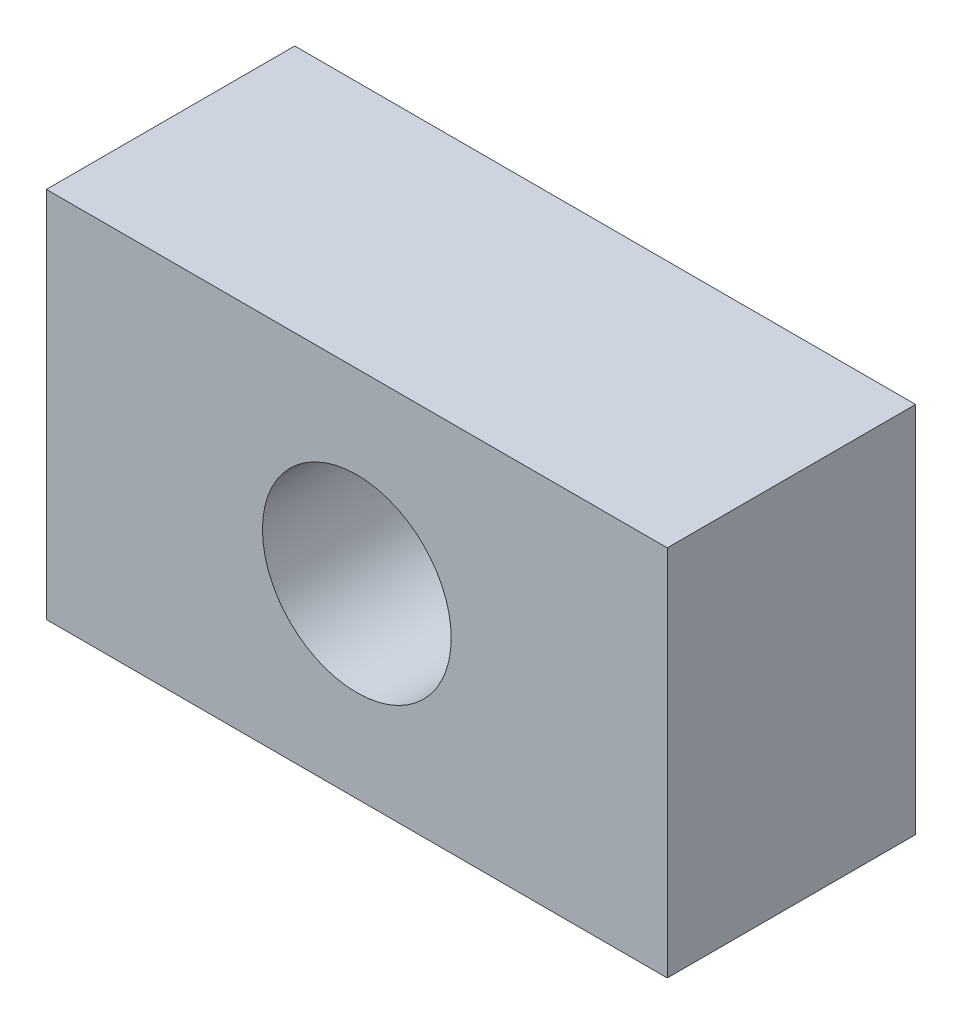
ISO-10303-21;
HEADER;
FILE_DESCRIPTION(('STEP AP214'),'2;1');
FILE_NAME('part.step','',(''),(''),'','','');
FILE_SCHEMA(('AUTOMOTIVE_DESIGN { 1 0 10303 214 1 1 1 1 }'));
ENDSEC;
DATA;
#1=APPLICATION_CONTEXT('core data for automotive mechanical design processes');
#2=APPLICATION_PROTOCOL_DEFINITION('international standard','automotive_design',2000,#1);
#3=PRODUCT_CONTEXT('',#1,'mechanical');
#4=PRODUCT('Part','Part','',(#3));
#5=PRODUCT_RELATED_PRODUCT_CATEGORY('part','',(#4));
#6=PRODUCT_DEFINITION_FORMATION('','',#4);
#7=PRODUCT_DEFINITION_CONTEXT('part definition',#1,'design');
#8=PRODUCT_DEFINITION('design','',#6,#7);
#9=PRODUCT_DEFINITION_SHAPE('','',#8);
#10=(LENGTH_UNIT() NAMED_UNIT(*) SI_UNIT(.MILLI.,.METRE.));
#11=(NAMED_UNIT(*) PLANE_ANGLE_UNIT() SI_UNIT($,.RADIAN.));
#12=(NAMED_UNIT(*) SI_UNIT($,.STERADIAN.) SOLID_ANGLE_UNIT());
#13=UNCERTAINTY_MEASURE_WITH_UNIT(LENGTH_MEASURE(1.E-05),#10,'distance_accuracy_value','');
#14=(GEOMETRIC_REPRESENTATION_CONTEXT(3) GLOBAL_UNCERTAINTY_ASSIGNED_CONTEXT((#13)) GLOBAL_UNIT_ASSIGNED_CONTEXT((#10,
#11,#12)) REPRESENTATION_CONTEXT('',''));
#15=CARTESIAN_POINT('',(0.,0.,0.));
#16=DIRECTION('',(0.,0.,1.));
#17=DIRECTION('',(1.,0.,0.));
#18=AXIS2_PLACEMENT_3D('',#15,#16,#17);
#19=CARTESIAN_POINT('',(0.,-38.1,25.4));
#20=DIRECTION('',(1.,0.,0.));
#21=DIRECTION('',(0.,0.,-1.));
#22=AXIS2_PLACEMENT_3D('',#19,#20,#21);
#23=PLANE('',#22);
#24=DIRECTION('',(0.,-1.,0.));
#25=VECTOR('',#24,1.);
#26=CARTESIAN_POINT('',(0.,-38.1,0.));
#27=LINE('',#26,#25);
#28=CARTESIAN_POINT('',(0.,0.,0.));
#29=VERTEX_POINT('',#28);
#30=CARTESIAN_POINT('',(0.,-38.1,0.));
#31=VERTEX_POINT('',#30);
#32=EDGE_CURVE('E96',#29,#31,#27,.T.);
#33=ORIENTED_EDGE('',*,*,#32,.T.);
#34=DIRECTION('',(0.,0.,-1.));
#35=VECTOR('',#34,1.);
#36=CARTESIAN_POINT('',(0.,-38.1,25.4));
#37=LINE('',#36,#35);
#38=CARTESIAN_POINT('',(0.,-38.1,25.4));
#39=VERTEX_POINT('',#38);
#40=EDGE_CURVE('E11',#39,#31,#37,.T.);
#41=ORIENTED_EDGE('',*,*,#40,.F.);
#42=DIRECTION('',(0.,-1.,0.));
#43=VECTOR('',#42,1.);
#44=CARTESIAN_POINT('',(0.,-38.1,25.4));
#45=LINE('',#44,#43);
#46=CARTESIAN_POINT('',(0.,0.,25.4));
#47=VERTEX_POINT('',#46);
#48=EDGE_CURVE('E84',#47,#39,#45,.T.);
#49=ORIENTED_EDGE('',*,*,#48,.F.);
#50=DIRECTION('',(0.,0.,-1.));
#51=VECTOR('',#50,1.);
#52=CARTESIAN_POINT('',(0.,0.,25.4));
#53=LINE('',#52,#51);
#54=EDGE_CURVE('E92',#47,#29,#53,.T.);
#55=ORIENTED_EDGE('',*,*,#54,.T.);
#56=EDGE_LOOP('',(#33,#41,#49,#55));
#57=FACE_BOUND('',#56,.T.);
#58=ADVANCED_FACE('F33',(#57),#23,.F.);
#59=CARTESIAN_POINT('',(63.5,-38.1,25.4));
#60=DIRECTION('',(0.,1.,0.));
#61=DIRECTION('',(0.,0.,1.));
#62=AXIS2_PLACEMENT_3D('',#59,#60,#61);
#63=PLANE('',#62);
#64=DIRECTION('',(1.,0.,0.));
#65=VECTOR('',#64,1.);
#66=CARTESIAN_POINT('',(63.5,-38.1,0.));
#67=LINE('',#66,#65);
#68=CARTESIAN_POINT('',(63.5,-38.1,0.));
#69=VERTEX_POINT('',#68);
#70=EDGE_CURVE('E88',#31,#69,#67,.T.);
#71=ORIENTED_EDGE('',*,*,#70,.T.);
#72=DIRECTION('',(0.,0.,-1.));
#73=VECTOR('',#72,1.);
#74=CARTESIAN_POINT('',(63.5,-38.1,25.4));
#75=LINE('',#74,#73);
#76=CARTESIAN_POINT('',(63.5,-38.1,25.4));
#77=VERTEX_POINT('',#76);
#78=EDGE_CURVE('E41',#77,#69,#75,.T.);
#79=ORIENTED_EDGE('',*,*,#78,.F.);
#80=DIRECTION('',(1.,0.,0.));
#81=VECTOR('',#80,1.);
#82=CARTESIAN_POINT('',(63.5,-38.1,25.4));
#83=LINE('',#82,#81);
#84=EDGE_CURVE('E79',#39,#77,#83,.T.);
#85=ORIENTED_EDGE('',*,*,#84,.F.);
#86=ORIENTED_EDGE('',*,*,#40,.T.);
#87=EDGE_LOOP('',(#71,#79,#85,#86));
#88=FACE_BOUND('',#87,.T.);
#89=ADVANCED_FACE('F87',(#88),#63,.F.);
#90=CARTESIAN_POINT('',(63.5,0.,25.4));
#91=DIRECTION('',(-1.,0.,0.));
#92=DIRECTION('',(0.,0.,1.));
#93=AXIS2_PLACEMENT_3D('',#90,#91,#92);
#94=PLANE('',#93);
#95=DIRECTION('',(0.,1.,0.));
#96=VECTOR('',#95,1.);
#97=CARTESIAN_POINT('',(63.5,0.,0.));
#98=LINE('',#97,#96);
#99=CARTESIAN_POINT('',(63.5,0.,0.));
#100=VERTEX_POINT('',#99);
#101=EDGE_CURVE('E66',#69,#100,#98,.T.);
#102=ORIENTED_EDGE('',*,*,#101,.T.);
#103=DIRECTION('',(0.,0.,-1.));
#104=VECTOR('',#103,1.);
#105=CARTESIAN_POINT('',(63.5,0.,25.4));
#106=LINE('',#105,#104);
#107=CARTESIAN_POINT('',(63.5,0.,25.4));
#108=VERTEX_POINT('',#107);
#109=EDGE_CURVE('E89',#108,#100,#106,.T.);
#110=ORIENTED_EDGE('',*,*,#109,.F.);
#111=DIRECTION('',(0.,1.,0.));
#112=VECTOR('',#111,1.);
#113=CARTESIAN_POINT('',(63.5,0.,25.4));
#114=LINE('',#113,#112);
#115=EDGE_CURVE('E82',#77,#108,#114,.T.);
#116=ORIENTED_EDGE('',*,*,#115,.F.);
#117=ORIENTED_EDGE('',*,*,#78,.T.);
#118=EDGE_LOOP('',(#102,#110,#116,#117));
#119=FACE_BOUND('',#118,.T.);
#120=ADVANCED_FACE('F90',(#119),#94,.F.);
#121=CARTESIAN_POINT('',(0.,0.,25.4));
#122=DIRECTION('',(0.,-1.,0.));
#123=DIRECTION('',(0.,0.,-1.));
#124=AXIS2_PLACEMENT_3D('',#121,#122,#123);
#125=PLANE('',#124);
#126=DIRECTION('',(-1.,0.,0.));
#127=VECTOR('',#126,1.);
#128=CARTESIAN_POINT('',(0.,0.,0.));
#129=LINE('',#128,#127);
#130=EDGE_CURVE('E72',#100,#29,#129,.T.);
#131=ORIENTED_EDGE('',*,*,#130,.T.);
#132=ORIENTED_EDGE('',*,*,#54,.F.);
#133=DIRECTION('',(-1.,0.,0.));
#134=VECTOR('',#133,1.);
#135=CARTESIAN_POINT('',(0.,0.,25.4));
#136=LINE('',#135,#134);
#137=EDGE_CURVE('E49',#108,#47,#136,.T.);
#138=ORIENTED_EDGE('',*,*,#137,.F.);
#139=ORIENTED_EDGE('',*,*,#109,.T.);
#140=EDGE_LOOP('',(#131,#132,#138,#139));
#141=FACE_BOUND('',#140,.T.);
#142=ADVANCED_FACE('F104',(#141),#125,.F.);
#143=CARTESIAN_POINT('',(0.,0.,25.4));
#144=DIRECTION('',(0.,0.,-1.));
#145=DIRECTION('',(-1.,0.,0.));
#146=AXIS2_PLACEMENT_3D('',#143,#144,#145);
#147=PLANE('',#146);
#148=CARTESIAN_POINT('',(31.75,-19.05,25.4));
#149=DIRECTION('',(0.,0.,1.));
#150=DIRECTION('',(1.,0.,0.));
#151=AXIS2_PLACEMENT_3D('',#148,#149,#150);
#152=CIRCLE('',#151,9.652);
#153=CARTESIAN_POINT('',(41.402,-19.05,25.4));
#154=VERTEX_POINT('',#153);
#155=EDGE_CURVE('E110',#154,#154,#152,.T.);
#156=ORIENTED_EDGE('',*,*,#155,.F.);
#157=EDGE_LOOP('',(#156));
#158=FACE_BOUND('',#157,.T.);
#159=ORIENTED_EDGE('',*,*,#48,.T.);
#160=ORIENTED_EDGE('',*,*,#84,.T.);
#161=ORIENTED_EDGE('',*,*,#115,.T.);
#162=ORIENTED_EDGE('',*,*,#137,.T.);
#163=EDGE_LOOP('',(#159,#160,#161,#162));
#164=FACE_BOUND('',#163,.T.);
#165=ADVANCED_FACE('F80',(#158,#164),#147,.F.);
#166=CARTESIAN_POINT('',(0.,0.,0.));
#167=DIRECTION('',(0.,0.,-1.));
#168=DIRECTION('',(-1.,0.,0.));
#169=AXIS2_PLACEMENT_3D('',#166,#167,#168);
#170=PLANE('',#169);
#171=ORIENTED_EDGE('',*,*,#32,.F.);
#172=ORIENTED_EDGE('',*,*,#130,.F.);
#173=ORIENTED_EDGE('',*,*,#101,.F.);
#174=ORIENTED_EDGE('',*,*,#70,.F.);
#175=EDGE_LOOP('',(#171,#172,#173,#174));
#176=FACE_BOUND('',#175,.T.);
#177=ADVANCED_FACE('F107',(#176),#170,.T.);
#178=CARTESIAN_POINT('',(31.75,-19.05,2.54));
#179=DIRECTION('',(0.,0.,1.));
#180=DIRECTION('',(1.,0.,0.));
#181=AXIS2_PLACEMENT_3D('',#178,#179,#180);
#182=CYLINDRICAL_SURFACE('',#181,9.652);
#183=CARTESIAN_POINT('',(31.75,-19.05,2.54));
#184=DIRECTION('',(0.,0.,1.));
#185=DIRECTION('',(1.,0.,0.));
#186=AXIS2_PLACEMENT_3D('',#183,#184,#185);
#187=CIRCLE('',#186,9.652);
#188=CARTESIAN_POINT('',(41.402,-19.05,2.54));
#189=VERTEX_POINT('',#188);
#190=EDGE_CURVE('E99',#189,#189,#187,.T.);
#191=ORIENTED_EDGE('',*,*,#190,.F.);
#192=EDGE_LOOP('',(#191));
#193=FACE_BOUND('',#192,.T.);
#194=ORIENTED_EDGE('',*,*,#155,.T.);
#195=EDGE_LOOP('',(#194));
#196=FACE_BOUND('',#195,.T.);
#197=ADVANCED_FACE('F118',(#193,#196),#182,.F.);
#198=CARTESIAN_POINT('',(31.75,-19.05,2.54));
#199=DIRECTION('',(0.,0.,1.));
#200=DIRECTION('',(1.,0.,0.));
#201=AXIS2_PLACEMENT_3D('',#198,#199,#200);
#202=PLANE('',#201);
#203=ORIENTED_EDGE('',*,*,#190,.T.);
#204=EDGE_LOOP('',(#203));
#205=FACE_BOUND('',#204,.T.);
#206=ADVANCED_FACE('F116',(#205),#202,.T.);
#207=CLOSED_SHELL('',(#58,#89,#120,#142,#165,#177,#197,#206));
#208=MANIFOLD_SOLID_BREP('B2',#207);
#209=ADVANCED_BREP_SHAPE_REPRESENTATION('',(#18,#208),#14);
#210=SHAPE_DEFINITION_REPRESENTATION(#9,#209);
ENDSEC;
END-ISO-10303-21;
